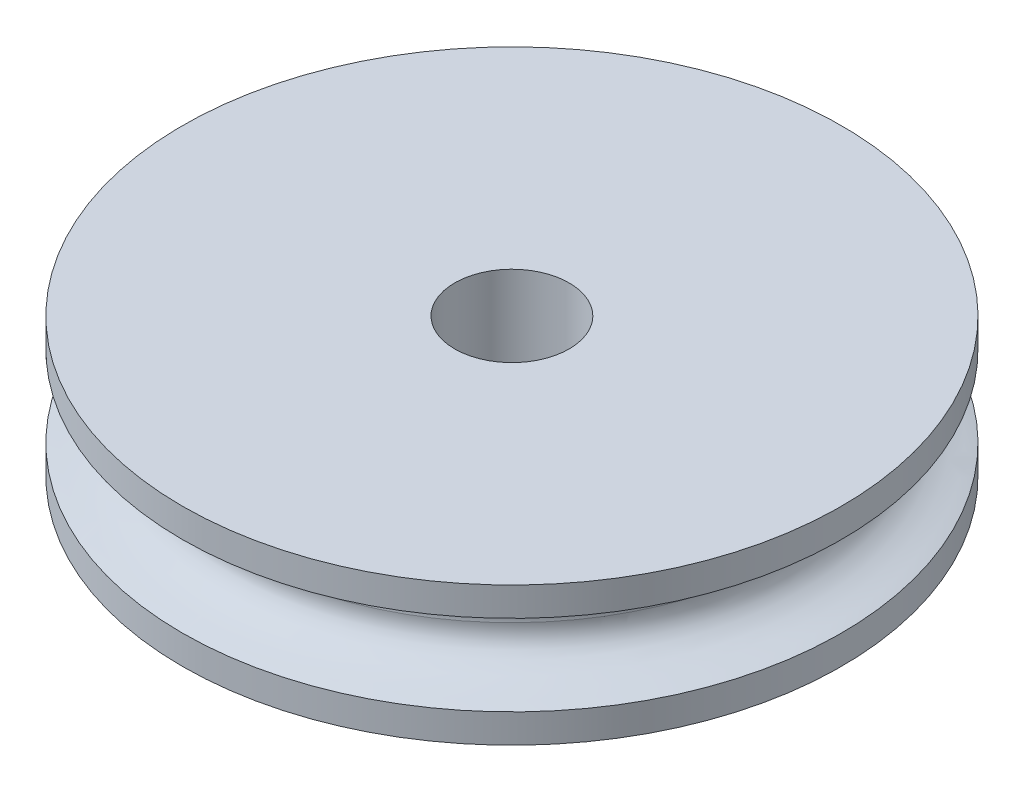
ISO-10303-21;
HEADER;
FILE_DESCRIPTION(('STEP AP214'),'2;1');
FILE_NAME('part.step','',(''),(''),'','','');
FILE_SCHEMA(('AUTOMOTIVE_DESIGN { 1 0 10303 214 1 1 1 1 }'));
ENDSEC;
DATA;
#1=APPLICATION_CONTEXT('core data for automotive mechanical design processes');
#2=APPLICATION_PROTOCOL_DEFINITION('international standard','automotive_design',2000,#1);
#3=PRODUCT_CONTEXT('',#1,'mechanical');
#4=PRODUCT('Part','Part','',(#3));
#5=PRODUCT_RELATED_PRODUCT_CATEGORY('part','',(#4));
#6=PRODUCT_DEFINITION_FORMATION('','',#4);
#7=PRODUCT_DEFINITION_CONTEXT('part definition',#1,'design');
#8=PRODUCT_DEFINITION('design','',#6,#7);
#9=PRODUCT_DEFINITION_SHAPE('','',#8);
#10=(LENGTH_UNIT() NAMED_UNIT(*) SI_UNIT(.MILLI.,.METRE.));
#11=(NAMED_UNIT(*) PLANE_ANGLE_UNIT() SI_UNIT($,.RADIAN.));
#12=(NAMED_UNIT(*) SI_UNIT($,.STERADIAN.) SOLID_ANGLE_UNIT());
#13=UNCERTAINTY_MEASURE_WITH_UNIT(LENGTH_MEASURE(1.E-05),#10,'distance_accuracy_value','');
#14=(GEOMETRIC_REPRESENTATION_CONTEXT(3) GLOBAL_UNCERTAINTY_ASSIGNED_CONTEXT((#13)) GLOBAL_UNIT_ASSIGNED_CONTEXT((#10,
#11,#12)) REPRESENTATION_CONTEXT('',''));
#15=CARTESIAN_POINT('',(0.,0.,0.));
#16=DIRECTION('',(0.,0.,1.));
#17=DIRECTION('',(1.,0.,0.));
#18=AXIS2_PLACEMENT_3D('',#15,#16,#17);
#19=CARTESIAN_POINT('',(0.,4.,0.));
#20=DIRECTION('',(0.,-1.,0.));
#21=DIRECTION('',(0.,0.,-1.));
#22=AXIS2_PLACEMENT_3D('',#19,#20,#21);
#23=CYLINDRICAL_SURFACE('',#22,9.5);
#24=CARTESIAN_POINT('',(0.,0.832825218891827,0.));
#25=DIRECTION('',(0.,1.,0.));
#26=DIRECTION('',(0.,0.,1.));
#27=AXIS2_PLACEMENT_3D('',#24,#25,#26);
#28=CIRCLE('',#27,9.5);
#29=CARTESIAN_POINT('',(0.,0.832825218891827,9.5));
#30=VERTEX_POINT('',#29);
#31=EDGE_CURVE('E49',#30,#30,#28,.T.);
#32=ORIENTED_EDGE('',*,*,#31,.F.);
#33=EDGE_LOOP('',(#32));
#34=FACE_BOUND('',#33,.T.);
#35=CARTESIAN_POINT('',(0.,0.,0.));
#36=DIRECTION('',(0.,1.,0.));
#37=DIRECTION('',(0.,0.,1.));
#38=AXIS2_PLACEMENT_3D('',#35,#36,#37);
#39=CIRCLE('',#38,9.5);
#40=CARTESIAN_POINT('',(0.,0.,9.5));
#41=VERTEX_POINT('',#40);
#42=EDGE_CURVE('E40',#41,#41,#39,.T.);
#43=ORIENTED_EDGE('',*,*,#42,.T.);
#44=EDGE_LOOP('',(#43));
#45=FACE_BOUND('',#44,.T.);
#46=ADVANCED_FACE('F37',(#34,#45),#23,.T.);
#47=CARTESIAN_POINT('',(0.,0.,0.));
#48=DIRECTION('',(0.,1.,0.));
#49=DIRECTION('',(0.,0.,1.));
#50=AXIS2_PLACEMENT_3D('',#47,#48,#49);
#51=PLANE('',#50);
#52=CARTESIAN_POINT('',(0.,0.,0.));
#53=DIRECTION('',(0.,1.,0.));
#54=DIRECTION('',(0.,0.,1.));
#55=AXIS2_PLACEMENT_3D('',#52,#53,#54);
#56=CIRCLE('',#55,1.65);
#57=CARTESIAN_POINT('',(0.,0.,1.65));
#58=VERTEX_POINT('',#57);
#59=EDGE_CURVE('E62',#58,#58,#56,.T.);
#60=ORIENTED_EDGE('',*,*,#59,.T.);
#61=EDGE_LOOP('',(#60));
#62=FACE_BOUND('',#61,.T.);
#63=ORIENTED_EDGE('',*,*,#42,.F.);
#64=EDGE_LOOP('',(#63));
#65=FACE_BOUND('',#64,.T.);
#66=ADVANCED_FACE('F85',(#62,#65),#51,.F.);
#67=CARTESIAN_POINT('',(-9.5,0.832825218891827,0.));
#68=CARTESIAN_POINT('',(-8.91100392274585,1.01519245042772,0.));
#69=CARTESIAN_POINT('',(-7.9401814519897,1.15692306977285,0.));
#70=CARTESIAN_POINT('',(-8.,2.,0.));
#71=B_SPLINE_CURVE_WITH_KNOTS('',3,(#67,#68,#69,#70),.UNSPECIFIED.,.F.,.F.,(4,4),(0.,1.),.UNSPECIFIED.);
#72=CARTESIAN_POINT('',(0.,4.2,0.));
#73=DIRECTION('',(0.,1.,0.));
#74=AXIS1_PLACEMENT('',#72,#73);
#75=SURFACE_OF_REVOLUTION('',#71,#74);
#76=CARTESIAN_POINT('',(0.,2.,0.));
#77=DIRECTION('',(0.,1.,0.));
#78=DIRECTION('',(0.,0.,1.));
#79=AXIS2_PLACEMENT_3D('',#76,#77,#78);
#80=CIRCLE('',#79,8.);
#81=CARTESIAN_POINT('',(0.,2.,8.));
#82=VERTEX_POINT('',#81);
#83=EDGE_CURVE('E54',#82,#82,#80,.T.);
#84=ORIENTED_EDGE('',*,*,#83,.F.);
#85=EDGE_LOOP('',(#84));
#86=FACE_BOUND('',#85,.T.);
#87=ORIENTED_EDGE('',*,*,#31,.T.);
#88=EDGE_LOOP('',(#87));
#89=FACE_BOUND('',#88,.T.);
#90=ADVANCED_FACE('F80',(#86,#89),#75,.T.);
#91=CARTESIAN_POINT('',(-9.5,3.16717478110817,0.));
#92=CARTESIAN_POINT('',(-8.91100392274585,2.98480754957228,0.));
#93=CARTESIAN_POINT('',(-7.9401814519897,2.84307693022715,0.));
#94=CARTESIAN_POINT('',(-8.,2.,0.));
#95=B_SPLINE_CURVE_WITH_KNOTS('',3,(#91,#92,#93,#94),.UNSPECIFIED.,.F.,.F.,(4,4),(0.,1.),.UNSPECIFIED.);
#96=CARTESIAN_POINT('',(0.,4.2,0.));
#97=DIRECTION('',(0.,1.,0.));
#98=AXIS1_PLACEMENT('',#96,#97);
#99=SURFACE_OF_REVOLUTION('',#95,#98);
#100=ORIENTED_EDGE('',*,*,#83,.T.);
#101=EDGE_LOOP('',(#100));
#102=FACE_BOUND('',#101,.T.);
#103=CARTESIAN_POINT('',(0.,3.16717478110817,0.));
#104=DIRECTION('',(0.,1.,0.));
#105=DIRECTION('',(0.,0.,1.));
#106=AXIS2_PLACEMENT_3D('',#103,#104,#105);
#107=CIRCLE('',#106,9.5);
#108=CARTESIAN_POINT('',(0.,3.16717478110817,9.5));
#109=VERTEX_POINT('',#108);
#110=EDGE_CURVE('E58',#109,#109,#107,.T.);
#111=ORIENTED_EDGE('',*,*,#110,.F.);
#112=EDGE_LOOP('',(#111));
#113=FACE_BOUND('',#112,.T.);
#114=ADVANCED_FACE('F75',(#102,#113),#99,.F.);
#115=CARTESIAN_POINT('',(0.,4.,0.));
#116=DIRECTION('',(0.,1.,0.));
#117=DIRECTION('',(0.,0.,1.));
#118=AXIS2_PLACEMENT_3D('',#115,#116,#117);
#119=PLANE('',#118);
#120=CARTESIAN_POINT('',(0.,4.,0.));
#121=DIRECTION('',(0.,1.,0.));
#122=DIRECTION('',(0.,0.,1.));
#123=AXIS2_PLACEMENT_3D('',#120,#121,#122);
#124=CIRCLE('',#123,1.65);
#125=CARTESIAN_POINT('',(0.,4.,1.65));
#126=VERTEX_POINT('',#125);
#127=EDGE_CURVE('E103',#126,#126,#124,.T.);
#128=ORIENTED_EDGE('',*,*,#127,.F.);
#129=EDGE_LOOP('',(#128));
#130=FACE_BOUND('',#129,.T.);
#131=CARTESIAN_POINT('',(0.,4.,0.));
#132=DIRECTION('',(0.,1.,0.));
#133=DIRECTION('',(0.,0.,1.));
#134=AXIS2_PLACEMENT_3D('',#131,#132,#133);
#135=CIRCLE('',#134,9.5);
#136=CARTESIAN_POINT('',(0.,4.,9.5));
#137=VERTEX_POINT('',#136);
#138=EDGE_CURVE('E10',#137,#137,#135,.T.);
#139=ORIENTED_EDGE('',*,*,#138,.T.);
#140=EDGE_LOOP('',(#139));
#141=FACE_BOUND('',#140,.T.);
#142=ADVANCED_FACE('F79',(#130,#141),#119,.T.);
#143=ORIENTED_EDGE('',*,*,#138,.F.);
#144=EDGE_LOOP('',(#143));
#145=FACE_BOUND('',#144,.T.);
#146=ORIENTED_EDGE('',*,*,#110,.T.);
#147=EDGE_LOOP('',(#146));
#148=FACE_BOUND('',#147,.T.);
#149=ADVANCED_FACE('F88',(#145,#148),#23,.T.);
#150=CARTESIAN_POINT('',(0.,0.,0.));
#151=DIRECTION('',(0.,1.,0.));
#152=DIRECTION('',(0.,0.,1.));
#153=AXIS2_PLACEMENT_3D('',#150,#151,#152);
#154=CYLINDRICAL_SURFACE('',#153,1.65);
#155=ORIENTED_EDGE('',*,*,#59,.F.);
#156=EDGE_LOOP('',(#155));
#157=FACE_BOUND('',#156,.T.);
#158=ORIENTED_EDGE('',*,*,#127,.T.);
#159=EDGE_LOOP('',(#158));
#160=FACE_BOUND('',#159,.T.);
#161=ADVANCED_FACE('F82',(#157,#160),#154,.F.);
#162=CLOSED_SHELL('',(#46,#66,#90,#114,#142,#149,#161));
#163=MANIFOLD_SOLID_BREP('B2',#162);
#164=ADVANCED_BREP_SHAPE_REPRESENTATION('',(#18,#163),#14);
#165=SHAPE_DEFINITION_REPRESENTATION(#9,#164);
ENDSEC;
END-ISO-10303-21;
